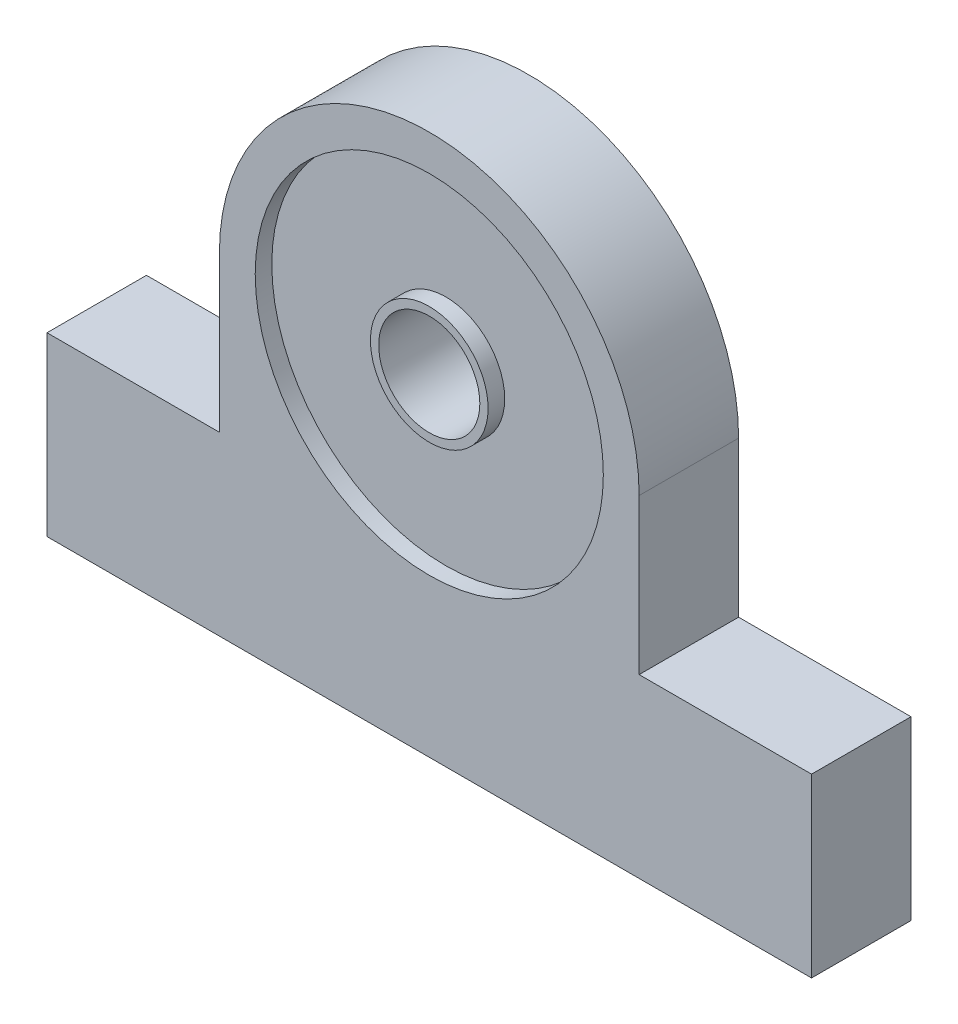
ISO-10303-21;
HEADER;
FILE_DESCRIPTION(('STEP AP214'),'2;1');
FILE_NAME('part.step','',(''),(''),'','','');
FILE_SCHEMA(('AUTOMOTIVE_DESIGN { 1 0 10303 214 1 1 1 1 }'));
ENDSEC;
DATA;
#1=APPLICATION_CONTEXT('core data for automotive mechanical design processes');
#2=APPLICATION_PROTOCOL_DEFINITION('international standard','automotive_design',2000,#1);
#3=PRODUCT_CONTEXT('',#1,'mechanical');
#4=PRODUCT('Part','Part','',(#3));
#5=PRODUCT_RELATED_PRODUCT_CATEGORY('part','',(#4));
#6=PRODUCT_DEFINITION_FORMATION('','',#4);
#7=PRODUCT_DEFINITION_CONTEXT('part definition',#1,'design');
#8=PRODUCT_DEFINITION('design','',#6,#7);
#9=PRODUCT_DEFINITION_SHAPE('','',#8);
#10=(LENGTH_UNIT() NAMED_UNIT(*) SI_UNIT(.MILLI.,.METRE.));
#11=(NAMED_UNIT(*) PLANE_ANGLE_UNIT() SI_UNIT($,.RADIAN.));
#12=(NAMED_UNIT(*) SI_UNIT($,.STERADIAN.) SOLID_ANGLE_UNIT());
#13=UNCERTAINTY_MEASURE_WITH_UNIT(LENGTH_MEASURE(1.E-05),#10,'distance_accuracy_value','');
#14=(GEOMETRIC_REPRESENTATION_CONTEXT(3) GLOBAL_UNCERTAINTY_ASSIGNED_CONTEXT((#13)) GLOBAL_UNIT_ASSIGNED_CONTEXT((#10,
#11,#12)) REPRESENTATION_CONTEXT('',''));
#15=CARTESIAN_POINT('',(0.,0.,0.));
#16=DIRECTION('',(0.,0.,1.));
#17=DIRECTION('',(1.,0.,0.));
#18=AXIS2_PLACEMENT_3D('',#15,#16,#17);
#19=CARTESIAN_POINT('',(0.,0.,6.));
#20=DIRECTION('',(0.,0.,1.));
#21=DIRECTION('',(1.,0.,0.));
#22=AXIS2_PLACEMENT_3D('',#19,#20,#21);
#23=PLANE('',#22);
#24=CARTESIAN_POINT('',(0.,0.,6.));
#25=DIRECTION('',(0.,0.,1.));
#26=DIRECTION('',(1.,0.,0.));
#27=AXIS2_PLACEMENT_3D('',#24,#25,#26);
#28=CIRCLE('',#27,10.5);
#29=CARTESIAN_POINT('',(10.5,0.,6.));
#30=VERTEX_POINT('',#29);
#31=EDGE_CURVE('E165',#30,#30,#28,.T.);
#32=ORIENTED_EDGE('',*,*,#31,.F.);
#33=EDGE_LOOP('',(#32));
#34=FACE_BOUND('',#33,.T.);
#35=DIRECTION('',(0.,-1.,0.));
#36=VECTOR('',#35,1.);
#37=CARTESIAN_POINT('',(-23.0606041531929,-9.35491578644278,6.));
#38=LINE('',#37,#36);
#39=CARTESIAN_POINT('',(-23.0606041531929,-9.35491578644278,6.));
#40=VERTEX_POINT('',#39);
#41=CARTESIAN_POINT('',(-23.0606041531929,-20.0049157864428,6.));
#42=VERTEX_POINT('',#41);
#43=EDGE_CURVE('E124',#40,#42,#38,.T.);
#44=ORIENTED_EDGE('',*,*,#43,.T.);
#45=DIRECTION('',(1.,0.,0.));
#46=VECTOR('',#45,1.);
#47=CARTESIAN_POINT('',(-23.0606041531929,-20.0049157864428,6.));
#48=LINE('',#47,#46);
#49=CARTESIAN_POINT('',(23.0606041531929,-20.0049157864428,6.));
#50=VERTEX_POINT('',#49);
#51=EDGE_CURVE('E133',#42,#50,#48,.T.);
#52=ORIENTED_EDGE('',*,*,#51,.T.);
#53=DIRECTION('',(0.,1.,0.));
#54=VECTOR('',#53,1.);
#55=CARTESIAN_POINT('',(23.0606041531929,-15.3549157864428,6.));
#56=LINE('',#55,#54);
#57=CARTESIAN_POINT('',(23.0606041531929,-9.35491578644278,6.));
#58=VERTEX_POINT('',#57);
#59=EDGE_CURVE('E94',#50,#58,#56,.T.);
#60=ORIENTED_EDGE('',*,*,#59,.T.);
#61=DIRECTION('',(-1.,0.,0.));
#62=VECTOR('',#61,1.);
#63=CARTESIAN_POINT('',(23.0606041531929,-9.35491578644278,6.));
#64=LINE('',#63,#62);
#65=CARTESIAN_POINT('',(12.6606041531929,-9.35491578644278,6.));
#66=VERTEX_POINT('',#65);
#67=EDGE_CURVE('E256',#58,#66,#64,.T.);
#68=ORIENTED_EDGE('',*,*,#67,.T.);
#69=DIRECTION('',(0.,1.,0.));
#70=VECTOR('',#69,1.);
#71=CARTESIAN_POINT('',(12.6606041531929,-9.35491578644278,6.));
#72=LINE('',#71,#70);
#73=CARTESIAN_POINT('',(12.6606041531929,0.,6.));
#74=VERTEX_POINT('',#73);
#75=EDGE_CURVE('E110',#66,#74,#72,.T.);
#76=ORIENTED_EDGE('',*,*,#75,.T.);
#77=CARTESIAN_POINT('',(0.,0.,6.));
#78=DIRECTION('',(0.,0.,1.));
#79=DIRECTION('',(1.,0.,0.));
#80=AXIS2_PLACEMENT_3D('',#77,#78,#79);
#81=CIRCLE('',#80,12.6606041531929);
#82=CARTESIAN_POINT('',(-12.6606041531929,0.,6.));
#83=VERTEX_POINT('',#82);
#84=EDGE_CURVE('E105',#74,#83,#81,.T.);
#85=ORIENTED_EDGE('',*,*,#84,.T.);
#86=DIRECTION('',(0.,-1.,0.));
#87=VECTOR('',#86,1.);
#88=CARTESIAN_POINT('',(-12.6606041531929,0.,6.));
#89=LINE('',#88,#87);
#90=CARTESIAN_POINT('',(-12.6606041531929,-9.35491578644278,6.));
#91=VERTEX_POINT('',#90);
#92=EDGE_CURVE('E108',#83,#91,#89,.T.);
#93=ORIENTED_EDGE('',*,*,#92,.T.);
#94=DIRECTION('',(-1.,0.,0.));
#95=VECTOR('',#94,1.);
#96=CARTESIAN_POINT('',(-12.6606041531929,-9.35491578644278,6.));
#97=LINE('',#96,#95);
#98=EDGE_CURVE('E56',#91,#40,#97,.T.);
#99=ORIENTED_EDGE('',*,*,#98,.T.);
#100=EDGE_LOOP('',(#44,#52,#60,#68,#76,#85,#93,#99));
#101=FACE_BOUND('',#100,.T.);
#102=ADVANCED_FACE('F39',(#34,#101),#23,.T.);
#103=CARTESIAN_POINT('',(0.,0.,0.));
#104=DIRECTION('',(0.,0.,1.));
#105=DIRECTION('',(1.,0.,0.));
#106=AXIS2_PLACEMENT_3D('',#103,#104,#105);
#107=PLANE('',#106);
#108=CARTESIAN_POINT('',(0.,0.,0.));
#109=DIRECTION('',(0.,0.,1.));
#110=DIRECTION('',(1.,0.,0.));
#111=AXIS2_PLACEMENT_3D('',#108,#109,#110);
#112=CIRCLE('',#111,3.55);
#113=CARTESIAN_POINT('',(3.55,0.,0.));
#114=VERTEX_POINT('',#113);
#115=EDGE_CURVE('E11',#114,#114,#112,.F.);
#116=ORIENTED_EDGE('',*,*,#115,.F.);
#117=EDGE_LOOP('',(#116));
#118=FACE_BOUND('',#117,.T.);
#119=DIRECTION('',(0.,1.,0.));
#120=VECTOR('',#119,1.);
#121=CARTESIAN_POINT('',(23.0606041531929,-15.3549157864428,0.));
#122=LINE('',#121,#120);
#123=CARTESIAN_POINT('',(23.0606041531929,-20.0049157864428,0.));
#124=VERTEX_POINT('',#123);
#125=CARTESIAN_POINT('',(23.0606041531929,-9.35491578644278,0.));
#126=VERTEX_POINT('',#125);
#127=EDGE_CURVE('E130',#124,#126,#122,.T.);
#128=ORIENTED_EDGE('',*,*,#127,.F.);
#129=DIRECTION('',(1.,0.,0.));
#130=VECTOR('',#129,1.);
#131=CARTESIAN_POINT('',(-23.0606041531929,-20.0049157864428,0.));
#132=LINE('',#131,#130);
#133=CARTESIAN_POINT('',(-23.0606041531929,-20.0049157864428,0.));
#134=VERTEX_POINT('',#133);
#135=EDGE_CURVE('E250',#134,#124,#132,.T.);
#136=ORIENTED_EDGE('',*,*,#135,.F.);
#137=DIRECTION('',(0.,-1.,0.));
#138=VECTOR('',#137,1.);
#139=CARTESIAN_POINT('',(-23.0606041531929,-9.35491578644278,0.));
#140=LINE('',#139,#138);
#141=CARTESIAN_POINT('',(-23.0606041531929,-9.35491578644278,0.));
#142=VERTEX_POINT('',#141);
#143=EDGE_CURVE('E140',#142,#134,#140,.T.);
#144=ORIENTED_EDGE('',*,*,#143,.F.);
#145=DIRECTION('',(-1.,0.,0.));
#146=VECTOR('',#145,1.);
#147=CARTESIAN_POINT('',(-12.6606041531929,-9.35491578644278,0.));
#148=LINE('',#147,#146);
#149=CARTESIAN_POINT('',(-12.6606041531929,-9.35491578644278,0.));
#150=VERTEX_POINT('',#149);
#151=EDGE_CURVE('E86',#150,#142,#148,.T.);
#152=ORIENTED_EDGE('',*,*,#151,.F.);
#153=DIRECTION('',(0.,-1.,0.));
#154=VECTOR('',#153,1.);
#155=CARTESIAN_POINT('',(-12.6606041531929,0.,0.));
#156=LINE('',#155,#154);
#157=CARTESIAN_POINT('',(-12.6606041531929,0.,0.));
#158=VERTEX_POINT('',#157);
#159=EDGE_CURVE('E80',#158,#150,#156,.T.);
#160=ORIENTED_EDGE('',*,*,#159,.F.);
#161=CARTESIAN_POINT('',(0.,0.,0.));
#162=DIRECTION('',(0.,0.,1.));
#163=DIRECTION('',(1.,0.,0.));
#164=AXIS2_PLACEMENT_3D('',#161,#162,#163);
#165=CIRCLE('',#164,12.6606041531929);
#166=CARTESIAN_POINT('',(12.6606041531929,0.,0.));
#167=VERTEX_POINT('',#166);
#168=EDGE_CURVE('E118',#167,#158,#165,.T.);
#169=ORIENTED_EDGE('',*,*,#168,.F.);
#170=DIRECTION('',(0.,1.,0.));
#171=VECTOR('',#170,1.);
#172=CARTESIAN_POINT('',(12.6606041531929,-9.35491578644278,0.));
#173=LINE('',#172,#171);
#174=CARTESIAN_POINT('',(12.6606041531929,-9.35491578644278,0.));
#175=VERTEX_POINT('',#174);
#176=EDGE_CURVE('E135',#175,#167,#173,.T.);
#177=ORIENTED_EDGE('',*,*,#176,.F.);
#178=DIRECTION('',(-1.,0.,0.));
#179=VECTOR('',#178,1.);
#180=CARTESIAN_POINT('',(23.0606041531929,-9.35491578644278,0.));
#181=LINE('',#180,#179);
#182=EDGE_CURVE('E132',#126,#175,#181,.T.);
#183=ORIENTED_EDGE('',*,*,#182,.F.);
#184=EDGE_LOOP('',(#128,#136,#144,#152,#160,#169,#177,#183));
#185=FACE_BOUND('',#184,.T.);
#186=ADVANCED_FACE('F41',(#118,#185),#107,.F.);
#187=CARTESIAN_POINT('',(0.,0.,5.));
#188=DIRECTION('',(0.,0.,1.));
#189=DIRECTION('',(1.,0.,0.));
#190=AXIS2_PLACEMENT_3D('',#187,#188,#189);
#191=CYLINDRICAL_SURFACE('',#190,10.5);
#192=CARTESIAN_POINT('',(0.,0.,5.));
#193=DIRECTION('',(0.,0.,1.));
#194=DIRECTION('',(1.,0.,0.));
#195=AXIS2_PLACEMENT_3D('',#192,#193,#194);
#196=CIRCLE('',#195,10.5);
#197=CARTESIAN_POINT('',(10.5,0.,5.));
#198=VERTEX_POINT('',#197);
#199=EDGE_CURVE('E48',#198,#198,#196,.T.);
#200=ORIENTED_EDGE('',*,*,#199,.F.);
#201=EDGE_LOOP('',(#200));
#202=FACE_BOUND('',#201,.T.);
#203=ORIENTED_EDGE('',*,*,#31,.T.);
#204=EDGE_LOOP('',(#203));
#205=FACE_BOUND('',#204,.T.);
#206=ADVANCED_FACE('F172',(#202,#205),#191,.F.);
#207=CARTESIAN_POINT('',(0.,0.,5.));
#208=DIRECTION('',(0.,0.,1.));
#209=DIRECTION('',(1.,0.,0.));
#210=AXIS2_PLACEMENT_3D('',#207,#208,#209);
#211=PLANE('',#210);
#212=CARTESIAN_POINT('',(0.,0.,5.));
#213=DIRECTION('',(0.,0.,1.));
#214=DIRECTION('',(1.,0.,0.));
#215=AXIS2_PLACEMENT_3D('',#212,#213,#214);
#216=CIRCLE('',#215,3.55);
#217=CARTESIAN_POINT('',(3.55,0.,5.));
#218=VERTEX_POINT('',#217);
#219=EDGE_CURVE('E161',#218,#218,#216,.T.);
#220=ORIENTED_EDGE('',*,*,#219,.F.);
#221=EDGE_LOOP('',(#220));
#222=FACE_BOUND('',#221,.T.);
#223=ORIENTED_EDGE('',*,*,#199,.T.);
#224=EDGE_LOOP('',(#223));
#225=FACE_BOUND('',#224,.T.);
#226=ADVANCED_FACE('F183',(#222,#225),#211,.T.);
#227=CARTESIAN_POINT('',(0.,0.,6.));
#228=DIRECTION('',(0.,0.,1.));
#229=DIRECTION('',(1.,0.,0.));
#230=AXIS2_PLACEMENT_3D('',#227,#228,#229);
#231=PLANE('',#230);
#232=CARTESIAN_POINT('',(0.,0.,6.));
#233=DIRECTION('',(0.,0.,1.));
#234=DIRECTION('',(1.,0.,0.));
#235=AXIS2_PLACEMENT_3D('',#232,#233,#234);
#236=CIRCLE('',#235,3.05);
#237=CARTESIAN_POINT('',(3.05,0.,6.));
#238=VERTEX_POINT('',#237);
#239=EDGE_CURVE('E158',#238,#238,#236,.T.);
#240=ORIENTED_EDGE('',*,*,#239,.F.);
#241=EDGE_LOOP('',(#240));
#242=FACE_BOUND('',#241,.T.);
#243=CARTESIAN_POINT('',(0.,0.,6.));
#244=DIRECTION('',(0.,0.,1.));
#245=DIRECTION('',(1.,0.,0.));
#246=AXIS2_PLACEMENT_3D('',#243,#244,#245);
#247=CIRCLE('',#246,3.55);
#248=CARTESIAN_POINT('',(3.55,0.,6.));
#249=VERTEX_POINT('',#248);
#250=EDGE_CURVE('E162',#249,#249,#247,.T.);
#251=ORIENTED_EDGE('',*,*,#250,.T.);
#252=EDGE_LOOP('',(#251));
#253=FACE_BOUND('',#252,.T.);
#254=ADVANCED_FACE('F187',(#242,#253),#231,.T.);
#255=CARTESIAN_POINT('',(0.,0.,6.));
#256=DIRECTION('',(0.,0.,-1.));
#257=DIRECTION('',(-1.,0.,0.));
#258=AXIS2_PLACEMENT_3D('',#255,#256,#257);
#259=CYLINDRICAL_SURFACE('',#258,3.55);
#260=ORIENTED_EDGE('',*,*,#250,.F.);
#261=EDGE_LOOP('',(#260));
#262=FACE_BOUND('',#261,.T.);
#263=ORIENTED_EDGE('',*,*,#219,.T.);
#264=EDGE_LOOP('',(#263));
#265=FACE_BOUND('',#264,.T.);
#266=ADVANCED_FACE('F189',(#262,#265),#259,.T.);
#267=CARTESIAN_POINT('',(0.,0.,0.));
#268=DIRECTION('',(0.,0.,1.));
#269=DIRECTION('',(1.,0.,0.));
#270=AXIS2_PLACEMENT_3D('',#267,#268,#269);
#271=CYLINDRICAL_SURFACE('',#270,3.05);
#272=ORIENTED_EDGE('',*,*,#239,.T.);
#273=EDGE_LOOP('',(#272));
#274=FACE_BOUND('',#273,.T.);
#275=CARTESIAN_POINT('',(0.,0.,-2.));
#276=DIRECTION('',(0.,0.,-1.));
#277=DIRECTION('',(-1.,0.,0.));
#278=AXIS2_PLACEMENT_3D('',#275,#276,#277);
#279=CIRCLE('',#278,3.05);
#280=CARTESIAN_POINT('',(-3.05,0.,-2.));
#281=VERTEX_POINT('',#280);
#282=EDGE_CURVE('E152',#281,#281,#279,.T.);
#283=ORIENTED_EDGE('',*,*,#282,.T.);
#284=EDGE_LOOP('',(#283));
#285=FACE_BOUND('',#284,.T.);
#286=ADVANCED_FACE('F192',(#274,#285),#271,.F.);
#287=CARTESIAN_POINT('',(0.,0.,-2.));
#288=DIRECTION('',(0.,0.,1.));
#289=DIRECTION('',(1.,0.,0.));
#290=AXIS2_PLACEMENT_3D('',#287,#288,#289);
#291=CYLINDRICAL_SURFACE('',#290,3.55);
#292=CARTESIAN_POINT('',(0.,0.,-2.));
#293=DIRECTION('',(0.,0.,-1.));
#294=DIRECTION('',(-1.,0.,0.));
#295=AXIS2_PLACEMENT_3D('',#292,#293,#294);
#296=CIRCLE('',#295,3.55);
#297=CARTESIAN_POINT('',(-3.55,0.,-2.));
#298=VERTEX_POINT('',#297);
#299=EDGE_CURVE('E155',#298,#298,#296,.T.);
#300=ORIENTED_EDGE('',*,*,#299,.F.);
#301=EDGE_LOOP('',(#300));
#302=FACE_BOUND('',#301,.T.);
#303=ORIENTED_EDGE('',*,*,#115,.T.);
#304=EDGE_LOOP('',(#303));
#305=FACE_BOUND('',#304,.T.);
#306=ADVANCED_FACE('F199',(#302,#305),#291,.T.);
#307=CARTESIAN_POINT('',(0.,0.,-2.));
#308=DIRECTION('',(0.,0.,-1.));
#309=DIRECTION('',(-1.,0.,0.));
#310=AXIS2_PLACEMENT_3D('',#307,#308,#309);
#311=PLANE('',#310);
#312=ORIENTED_EDGE('',*,*,#282,.F.);
#313=EDGE_LOOP('',(#312));
#314=FACE_BOUND('',#313,.T.);
#315=ORIENTED_EDGE('',*,*,#299,.T.);
#316=EDGE_LOOP('',(#315));
#317=FACE_BOUND('',#316,.T.);
#318=ADVANCED_FACE('F203',(#314,#317),#311,.T.);
#319=CARTESIAN_POINT('',(23.0606041531929,-15.3549157864428,6.));
#320=DIRECTION('',(-1.,0.,0.));
#321=DIRECTION('',(0.,-1.,0.));
#322=AXIS2_PLACEMENT_3D('',#319,#320,#321);
#323=PLANE('',#322);
#324=ORIENTED_EDGE('',*,*,#127,.T.);
#325=DIRECTION('',(0.,0.,-1.));
#326=VECTOR('',#325,1.);
#327=CARTESIAN_POINT('',(23.0606041531929,-9.35491578644278,6.));
#328=LINE('',#327,#326);
#329=EDGE_CURVE('E149',#58,#126,#328,.T.);
#330=ORIENTED_EDGE('',*,*,#329,.F.);
#331=ORIENTED_EDGE('',*,*,#59,.F.);
#332=DIRECTION('',(0.,0.,-1.));
#333=VECTOR('',#332,1.);
#334=CARTESIAN_POINT('',(23.0606041531929,-20.0049157864428,52.35502513904));
#335=LINE('',#334,#333);
#336=EDGE_CURVE('E245',#50,#124,#335,.T.);
#337=ORIENTED_EDGE('',*,*,#336,.T.);
#338=EDGE_LOOP('',(#324,#330,#331,#337));
#339=FACE_BOUND('',#338,.T.);
#340=ADVANCED_FACE('F207',(#339),#323,.F.);
#341=CARTESIAN_POINT('',(23.0606041531929,-9.35491578644278,6.));
#342=DIRECTION('',(0.,-1.,0.));
#343=DIRECTION('',(1.,0.,0.));
#344=AXIS2_PLACEMENT_3D('',#341,#342,#343);
#345=PLANE('',#344);
#346=ORIENTED_EDGE('',*,*,#182,.T.);
#347=DIRECTION('',(0.,0.,-1.));
#348=VECTOR('',#347,1.);
#349=CARTESIAN_POINT('',(12.6606041531929,-9.35491578644278,6.));
#350=LINE('',#349,#348);
#351=EDGE_CURVE('E146',#66,#175,#350,.T.);
#352=ORIENTED_EDGE('',*,*,#351,.F.);
#353=ORIENTED_EDGE('',*,*,#67,.F.);
#354=ORIENTED_EDGE('',*,*,#329,.T.);
#355=EDGE_LOOP('',(#346,#352,#353,#354));
#356=FACE_BOUND('',#355,.T.);
#357=ADVANCED_FACE('F211',(#356),#345,.F.);
#358=CARTESIAN_POINT('',(12.6606041531929,-9.35491578644278,6.));
#359=DIRECTION('',(-1.,0.,0.));
#360=DIRECTION('',(0.,-1.,0.));
#361=AXIS2_PLACEMENT_3D('',#358,#359,#360);
#362=PLANE('',#361);
#363=ORIENTED_EDGE('',*,*,#176,.T.);
#364=DIRECTION('',(0.,0.,-1.));
#365=VECTOR('',#364,1.);
#366=CARTESIAN_POINT('',(12.6606041531929,0.,6.));
#367=LINE('',#366,#365);
#368=EDGE_CURVE('E119',#74,#167,#367,.T.);
#369=ORIENTED_EDGE('',*,*,#368,.F.);
#370=ORIENTED_EDGE('',*,*,#75,.F.);
#371=ORIENTED_EDGE('',*,*,#351,.T.);
#372=EDGE_LOOP('',(#363,#369,#370,#371));
#373=FACE_BOUND('',#372,.T.);
#374=ADVANCED_FACE('F215',(#373),#362,.F.);
#375=CARTESIAN_POINT('',(0.,0.,6.));
#376=DIRECTION('',(0.,0.,-1.));
#377=DIRECTION('',(-1.,0.,0.));
#378=AXIS2_PLACEMENT_3D('',#375,#376,#377);
#379=CYLINDRICAL_SURFACE('',#378,12.6606041531929);
#380=ORIENTED_EDGE('',*,*,#168,.T.);
#381=DIRECTION('',(0.,0.,-1.));
#382=VECTOR('',#381,1.);
#383=CARTESIAN_POINT('',(-12.6606041531929,0.,6.));
#384=LINE('',#383,#382);
#385=EDGE_CURVE('E115',#83,#158,#384,.T.);
#386=ORIENTED_EDGE('',*,*,#385,.F.);
#387=ORIENTED_EDGE('',*,*,#84,.F.);
#388=ORIENTED_EDGE('',*,*,#368,.T.);
#389=EDGE_LOOP('',(#380,#386,#387,#388));
#390=FACE_BOUND('',#389,.T.);
#391=ADVANCED_FACE('F116',(#390),#379,.T.);
#392=CARTESIAN_POINT('',(-12.6606041531929,0.,6.));
#393=DIRECTION('',(1.,0.,0.));
#394=DIRECTION('',(0.,1.,0.));
#395=AXIS2_PLACEMENT_3D('',#392,#393,#394);
#396=PLANE('',#395);
#397=ORIENTED_EDGE('',*,*,#159,.T.);
#398=DIRECTION('',(0.,0.,-1.));
#399=VECTOR('',#398,1.);
#400=CARTESIAN_POINT('',(-12.6606041531929,-9.35491578644278,6.));
#401=LINE('',#400,#399);
#402=EDGE_CURVE('E120',#91,#150,#401,.T.);
#403=ORIENTED_EDGE('',*,*,#402,.F.);
#404=ORIENTED_EDGE('',*,*,#92,.F.);
#405=ORIENTED_EDGE('',*,*,#385,.T.);
#406=EDGE_LOOP('',(#397,#403,#404,#405));
#407=FACE_BOUND('',#406,.T.);
#408=ADVANCED_FACE('F122',(#407),#396,.F.);
#409=CARTESIAN_POINT('',(-12.6606041531929,-9.35491578644278,6.));
#410=DIRECTION('',(0.,-1.,0.));
#411=DIRECTION('',(0.,0.,-1.));
#412=AXIS2_PLACEMENT_3D('',#409,#410,#411);
#413=PLANE('',#412);
#414=ORIENTED_EDGE('',*,*,#151,.T.);
#415=DIRECTION('',(0.,0.,-1.));
#416=VECTOR('',#415,1.);
#417=CARTESIAN_POINT('',(-23.0606041531929,-9.35491578644278,6.));
#418=LINE('',#417,#416);
#419=EDGE_CURVE('E129',#40,#142,#418,.T.);
#420=ORIENTED_EDGE('',*,*,#419,.F.);
#421=ORIENTED_EDGE('',*,*,#98,.F.);
#422=ORIENTED_EDGE('',*,*,#402,.T.);
#423=EDGE_LOOP('',(#414,#420,#421,#422));
#424=FACE_BOUND('',#423,.T.);
#425=ADVANCED_FACE('F224',(#424),#413,.F.);
#426=CARTESIAN_POINT('',(-23.0606041531929,-9.35491578644278,6.));
#427=DIRECTION('',(1.,0.,0.));
#428=DIRECTION('',(0.,0.,-1.));
#429=AXIS2_PLACEMENT_3D('',#426,#427,#428);
#430=PLANE('',#429);
#431=ORIENTED_EDGE('',*,*,#143,.T.);
#432=DIRECTION('',(0.,0.,-1.));
#433=VECTOR('',#432,1.);
#434=CARTESIAN_POINT('',(-23.0606041531929,-20.0049157864428,52.35502513904));
#435=LINE('',#434,#433);
#436=EDGE_CURVE('E241',#42,#134,#435,.T.);
#437=ORIENTED_EDGE('',*,*,#436,.F.);
#438=ORIENTED_EDGE('',*,*,#43,.F.);
#439=ORIENTED_EDGE('',*,*,#419,.T.);
#440=EDGE_LOOP('',(#431,#437,#438,#439));
#441=FACE_BOUND('',#440,.T.);
#442=ADVANCED_FACE('F226',(#441),#430,.F.);
#443=CARTESIAN_POINT('',(-23.0606041531929,-20.0049157864428,52.35502513904));
#444=DIRECTION('',(0.,1.,0.));
#445=DIRECTION('',(0.,0.,1.));
#446=AXIS2_PLACEMENT_3D('',#443,#444,#445);
#447=PLANE('',#446);
#448=ORIENTED_EDGE('',*,*,#51,.F.);
#449=ORIENTED_EDGE('',*,*,#436,.T.);
#450=ORIENTED_EDGE('',*,*,#135,.T.);
#451=ORIENTED_EDGE('',*,*,#336,.F.);
#452=EDGE_LOOP('',(#448,#449,#450,#451));
#453=FACE_BOUND('',#452,.T.);
#454=ADVANCED_FACE('F229',(#453),#447,.F.);
#455=CLOSED_SHELL('',(#102,#186,#206,#226,#254,#266,#286,#306,#318,#340,#357,#374,#391,#408,
#425,#442,#454));
#456=MANIFOLD_SOLID_BREP('B2',#455);
#457=ADVANCED_BREP_SHAPE_REPRESENTATION('',(#18,#456),#14);
#458=SHAPE_DEFINITION_REPRESENTATION(#9,#457);
ENDSEC;
END-ISO-10303-21;
